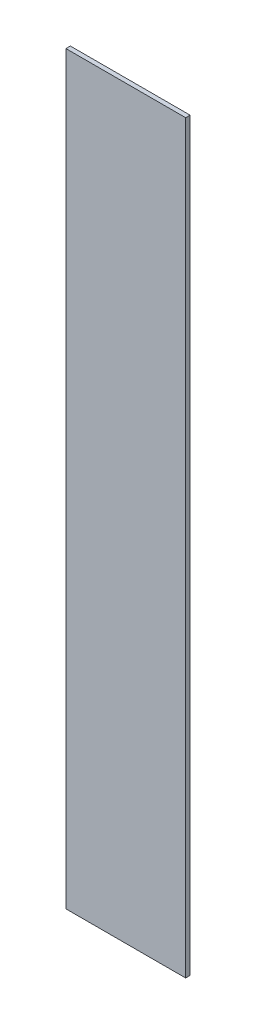
ISO-10303-21;
HEADER;
FILE_DESCRIPTION(('STEP AP214'),'2;1');
FILE_NAME('part.step','',(''),(''),'','','');
FILE_SCHEMA(('AUTOMOTIVE_DESIGN { 1 0 10303 214 1 1 1 1 }'));
ENDSEC;
DATA;
#1=APPLICATION_CONTEXT('core data for automotive mechanical design processes');
#2=APPLICATION_PROTOCOL_DEFINITION('international standard','automotive_design',2000,#1);
#3=PRODUCT_CONTEXT('',#1,'mechanical');
#4=PRODUCT('Part','Part','',(#3));
#5=PRODUCT_RELATED_PRODUCT_CATEGORY('part','',(#4));
#6=PRODUCT_DEFINITION_FORMATION('','',#4);
#7=PRODUCT_DEFINITION_CONTEXT('part definition',#1,'design');
#8=PRODUCT_DEFINITION('design','',#6,#7);
#9=PRODUCT_DEFINITION_SHAPE('','',#8);
#10=(LENGTH_UNIT() NAMED_UNIT(*) SI_UNIT(.MILLI.,.METRE.));
#11=(NAMED_UNIT(*) PLANE_ANGLE_UNIT() SI_UNIT($,.RADIAN.));
#12=(NAMED_UNIT(*) SI_UNIT($,.STERADIAN.) SOLID_ANGLE_UNIT());
#13=UNCERTAINTY_MEASURE_WITH_UNIT(LENGTH_MEASURE(1.E-05),#10,'distance_accuracy_value','');
#14=(GEOMETRIC_REPRESENTATION_CONTEXT(3) GLOBAL_UNCERTAINTY_ASSIGNED_CONTEXT((#13)) GLOBAL_UNIT_ASSIGNED_CONTEXT((#10,
#11,#12)) REPRESENTATION_CONTEXT('',''));
#15=CARTESIAN_POINT('',(0.,0.,0.));
#16=DIRECTION('',(0.,0.,1.));
#17=DIRECTION('',(1.,0.,0.));
#18=AXIS2_PLACEMENT_3D('',#15,#16,#17);
#19=CARTESIAN_POINT('',(171.45,-1066.8,12.7));
#20=DIRECTION('',(-1.,0.,0.));
#21=DIRECTION('',(0.,0.,1.));
#22=AXIS2_PLACEMENT_3D('',#19,#20,#21);
#23=PLANE('',#22);
#24=DIRECTION('',(0.,1.,0.));
#25=VECTOR('',#24,1.);
#26=CARTESIAN_POINT('',(171.45,-1066.8,0.));
#27=LINE('',#26,#25);
#28=CARTESIAN_POINT('',(171.45,-1066.8,0.));
#29=VERTEX_POINT('',#28);
#30=CARTESIAN_POINT('',(171.45,1066.8,0.));
#31=VERTEX_POINT('',#30);
#32=EDGE_CURVE('E96',#29,#31,#27,.T.);
#33=ORIENTED_EDGE('',*,*,#32,.T.);
#34=DIRECTION('',(0.,0.,-1.));
#35=VECTOR('',#34,1.);
#36=CARTESIAN_POINT('',(171.45,1066.8,12.7));
#37=LINE('',#36,#35);
#38=CARTESIAN_POINT('',(171.45,1066.8,12.7));
#39=VERTEX_POINT('',#38);
#40=EDGE_CURVE('E11',#39,#31,#37,.T.);
#41=ORIENTED_EDGE('',*,*,#40,.F.);
#42=DIRECTION('',(0.,1.,0.));
#43=VECTOR('',#42,1.);
#44=CARTESIAN_POINT('',(171.45,-1066.8,12.7));
#45=LINE('',#44,#43);
#46=CARTESIAN_POINT('',(171.45,-1066.8,12.7));
#47=VERTEX_POINT('',#46);
#48=EDGE_CURVE('E84',#47,#39,#45,.T.);
#49=ORIENTED_EDGE('',*,*,#48,.F.);
#50=DIRECTION('',(0.,0.,-1.));
#51=VECTOR('',#50,1.);
#52=CARTESIAN_POINT('',(171.45,-1066.8,12.7));
#53=LINE('',#52,#51);
#54=EDGE_CURVE('E92',#47,#29,#53,.T.);
#55=ORIENTED_EDGE('',*,*,#54,.T.);
#56=EDGE_LOOP('',(#33,#41,#49,#55));
#57=FACE_BOUND('',#56,.T.);
#58=ADVANCED_FACE('F33',(#57),#23,.F.);
#59=CARTESIAN_POINT('',(-171.45,1066.8,12.7));
#60=DIRECTION('',(0.,-1.,0.));
#61=DIRECTION('',(0.,0.,-1.));
#62=AXIS2_PLACEMENT_3D('',#59,#60,#61);
#63=PLANE('',#62);
#64=DIRECTION('',(-1.,0.,0.));
#65=VECTOR('',#64,1.);
#66=CARTESIAN_POINT('',(-171.45,1066.8,0.));
#67=LINE('',#66,#65);
#68=CARTESIAN_POINT('',(-171.45,1066.8,0.));
#69=VERTEX_POINT('',#68);
#70=EDGE_CURVE('E88',#31,#69,#67,.T.);
#71=ORIENTED_EDGE('',*,*,#70,.T.);
#72=DIRECTION('',(0.,0.,-1.));
#73=VECTOR('',#72,1.);
#74=CARTESIAN_POINT('',(-171.45,1066.8,12.7));
#75=LINE('',#74,#73);
#76=CARTESIAN_POINT('',(-171.45,1066.8,12.7));
#77=VERTEX_POINT('',#76);
#78=EDGE_CURVE('E41',#77,#69,#75,.T.);
#79=ORIENTED_EDGE('',*,*,#78,.F.);
#80=DIRECTION('',(-1.,0.,0.));
#81=VECTOR('',#80,1.);
#82=CARTESIAN_POINT('',(-171.45,1066.8,12.7));
#83=LINE('',#82,#81);
#84=EDGE_CURVE('E79',#39,#77,#83,.T.);
#85=ORIENTED_EDGE('',*,*,#84,.F.);
#86=ORIENTED_EDGE('',*,*,#40,.T.);
#87=EDGE_LOOP('',(#71,#79,#85,#86));
#88=FACE_BOUND('',#87,.T.);
#89=ADVANCED_FACE('F87',(#88),#63,.F.);
#90=CARTESIAN_POINT('',(-171.45,-1066.8,12.7));
#91=DIRECTION('',(1.,0.,0.));
#92=DIRECTION('',(0.,0.,-1.));
#93=AXIS2_PLACEMENT_3D('',#90,#91,#92);
#94=PLANE('',#93);
#95=DIRECTION('',(0.,-1.,0.));
#96=VECTOR('',#95,1.);
#97=CARTESIAN_POINT('',(-171.45,-1066.8,0.));
#98=LINE('',#97,#96);
#99=CARTESIAN_POINT('',(-171.45,-1066.8,0.));
#100=VERTEX_POINT('',#99);
#101=EDGE_CURVE('E66',#69,#100,#98,.T.);
#102=ORIENTED_EDGE('',*,*,#101,.T.);
#103=DIRECTION('',(0.,0.,-1.));
#104=VECTOR('',#103,1.);
#105=CARTESIAN_POINT('',(-171.45,-1066.8,12.7));
#106=LINE('',#105,#104);
#107=CARTESIAN_POINT('',(-171.45,-1066.8,12.7));
#108=VERTEX_POINT('',#107);
#109=EDGE_CURVE('E89',#108,#100,#106,.T.);
#110=ORIENTED_EDGE('',*,*,#109,.F.);
#111=DIRECTION('',(0.,-1.,0.));
#112=VECTOR('',#111,1.);
#113=CARTESIAN_POINT('',(-171.45,-1066.8,12.7));
#114=LINE('',#113,#112);
#115=EDGE_CURVE('E82',#77,#108,#114,.T.);
#116=ORIENTED_EDGE('',*,*,#115,.F.);
#117=ORIENTED_EDGE('',*,*,#78,.T.);
#118=EDGE_LOOP('',(#102,#110,#116,#117));
#119=FACE_BOUND('',#118,.T.);
#120=ADVANCED_FACE('F90',(#119),#94,.F.);
#121=CARTESIAN_POINT('',(-171.45,-1066.8,12.7));
#122=DIRECTION('',(0.,1.,0.));
#123=DIRECTION('',(0.,0.,1.));
#124=AXIS2_PLACEMENT_3D('',#121,#122,#123);
#125=PLANE('',#124);
#126=DIRECTION('',(1.,0.,0.));
#127=VECTOR('',#126,1.);
#128=CARTESIAN_POINT('',(-171.45,-1066.8,0.));
#129=LINE('',#128,#127);
#130=EDGE_CURVE('E72',#100,#29,#129,.T.);
#131=ORIENTED_EDGE('',*,*,#130,.T.);
#132=ORIENTED_EDGE('',*,*,#54,.F.);
#133=DIRECTION('',(1.,0.,0.));
#134=VECTOR('',#133,1.);
#135=CARTESIAN_POINT('',(-171.45,-1066.8,12.7));
#136=LINE('',#135,#134);
#137=EDGE_CURVE('E49',#108,#47,#136,.T.);
#138=ORIENTED_EDGE('',*,*,#137,.F.);
#139=ORIENTED_EDGE('',*,*,#109,.T.);
#140=EDGE_LOOP('',(#131,#132,#138,#139));
#141=FACE_BOUND('',#140,.T.);
#142=ADVANCED_FACE('F103',(#141),#125,.F.);
#143=CARTESIAN_POINT('',(0.,0.,12.7));
#144=DIRECTION('',(0.,0.,-1.));
#145=DIRECTION('',(-1.,0.,0.));
#146=AXIS2_PLACEMENT_3D('',#143,#144,#145);
#147=PLANE('',#146);
#148=ORIENTED_EDGE('',*,*,#48,.T.);
#149=ORIENTED_EDGE('',*,*,#84,.T.);
#150=ORIENTED_EDGE('',*,*,#115,.T.);
#151=ORIENTED_EDGE('',*,*,#137,.T.);
#152=EDGE_LOOP('',(#148,#149,#150,#151));
#153=FACE_BOUND('',#152,.T.);
#154=ADVANCED_FACE('F80',(#153),#147,.F.);
#155=CARTESIAN_POINT('',(0.,0.,0.));
#156=DIRECTION('',(0.,0.,-1.));
#157=DIRECTION('',(-1.,0.,0.));
#158=AXIS2_PLACEMENT_3D('',#155,#156,#157);
#159=PLANE('',#158);
#160=ORIENTED_EDGE('',*,*,#32,.F.);
#161=ORIENTED_EDGE('',*,*,#130,.F.);
#162=ORIENTED_EDGE('',*,*,#101,.F.);
#163=ORIENTED_EDGE('',*,*,#70,.F.);
#164=EDGE_LOOP('',(#160,#161,#162,#163));
#165=FACE_BOUND('',#164,.T.);
#166=ADVANCED_FACE('F106',(#165),#159,.T.);
#167=CLOSED_SHELL('',(#58,#89,#120,#142,#154,#166));
#168=MANIFOLD_SOLID_BREP('B2',#167);
#169=ADVANCED_BREP_SHAPE_REPRESENTATION('',(#18,#168),#14);
#170=SHAPE_DEFINITION_REPRESENTATION(#9,#169);
ENDSEC;
END-ISO-10303-21;
